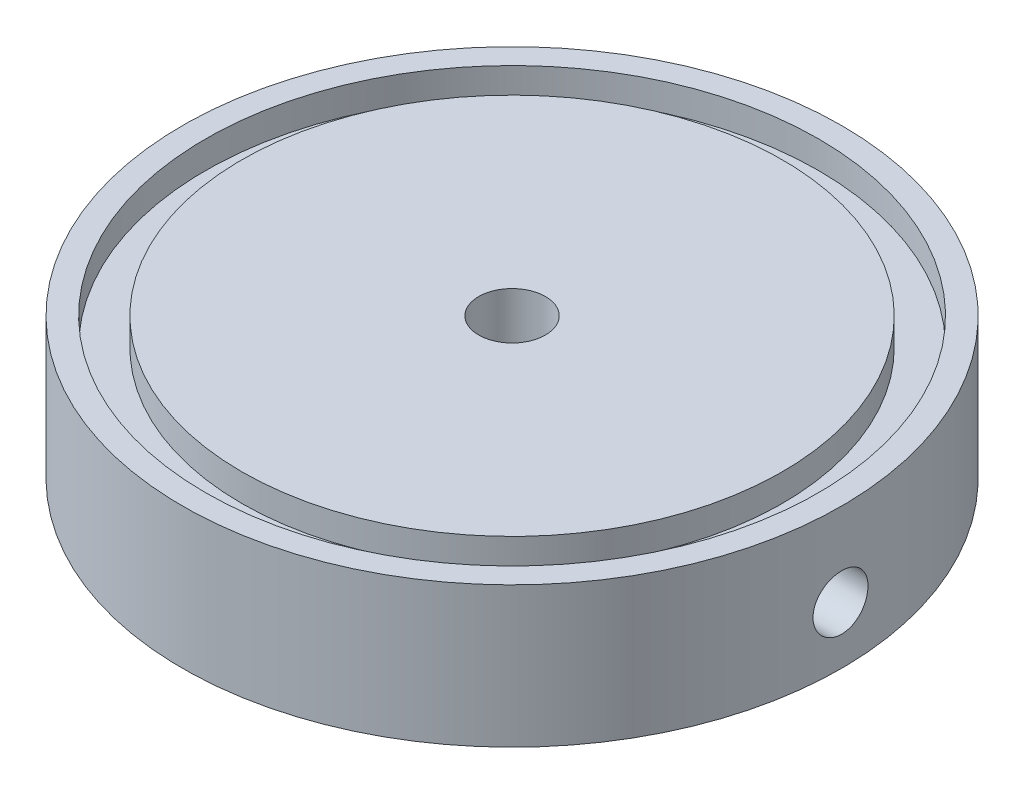
ISO-10303-21;
HEADER;
FILE_DESCRIPTION(('STEP AP214'),'2;1');
FILE_NAME('part.step','',(''),(''),'','','');
FILE_SCHEMA(('AUTOMOTIVE_DESIGN { 1 0 10303 214 1 1 1 1 }'));
ENDSEC;
DATA;
#1=APPLICATION_CONTEXT('core data for automotive mechanical design processes');
#2=APPLICATION_PROTOCOL_DEFINITION('international standard','automotive_design',2000,#1);
#3=PRODUCT_CONTEXT('',#1,'mechanical');
#4=PRODUCT('Part','Part','',(#3));
#5=PRODUCT_RELATED_PRODUCT_CATEGORY('part','',(#4));
#6=PRODUCT_DEFINITION_FORMATION('','',#4);
#7=PRODUCT_DEFINITION_CONTEXT('part definition',#1,'design');
#8=PRODUCT_DEFINITION('design','',#6,#7);
#9=PRODUCT_DEFINITION_SHAPE('','',#8);
#10=(LENGTH_UNIT() NAMED_UNIT(*) SI_UNIT(.MILLI.,.METRE.));
#11=(NAMED_UNIT(*) PLANE_ANGLE_UNIT() SI_UNIT($,.RADIAN.));
#12=(NAMED_UNIT(*) SI_UNIT($,.STERADIAN.) SOLID_ANGLE_UNIT());
#13=UNCERTAINTY_MEASURE_WITH_UNIT(LENGTH_MEASURE(1.E-05),#10,'distance_accuracy_value','');
#14=(GEOMETRIC_REPRESENTATION_CONTEXT(3) GLOBAL_UNCERTAINTY_ASSIGNED_CONTEXT((#13)) GLOBAL_UNIT_ASSIGNED_CONTEXT((#10,
#11,#12)) REPRESENTATION_CONTEXT('',''));
#15=CARTESIAN_POINT('',(0.,0.,0.));
#16=DIRECTION('',(0.,0.,1.));
#17=DIRECTION('',(1.,0.,0.));
#18=AXIS2_PLACEMENT_3D('',#15,#16,#17);
#19=CARTESIAN_POINT('',(38.1,-2.28600000000442,0.));
#20=DIRECTION('',(-1.,0.,0.));
#21=DIRECTION('',(0.,0.,1.));
#22=AXIS2_PLACEMENT_3D('',#19,#20,#21);
#23=CYLINDRICAL_SURFACE('',#22,1.7272);
#24=CARTESIAN_POINT('',(4.80191535530144,-0.723623755532479,-0.736342522682037));
#25=CARTESIAN_POINT('',(4.77186223711895,-0.695508027662611,-0.6766842015263));
#26=CARTESIAN_POINT('',(4.74519728640824,-0.670149780641417,-0.613995515617501));
#27=CARTESIAN_POINT('',(4.6997006609823,-0.62642981667209,-0.483501887721507));
#28=CARTESIAN_POINT('',(4.68086706884819,-0.608066387215166,-0.415698202892281));
#29=CARTESIAN_POINT('',(4.65179372325206,-0.579545173145753,-0.276251443595078));
#30=CARTESIAN_POINT('',(4.6415920832701,-0.569423787725918,-0.204592812198787));
#31=CARTESIAN_POINT('',(4.63040032480049,-0.558313427353962,-0.0598561049839643));
#32=CARTESIAN_POINT('',(4.62940859792253,-0.557322857825036,0.013221720757056));
#33=CARTESIAN_POINT('',(4.63649837031051,-0.564368860657253,0.154897778871572));
#34=CARTESIAN_POINT('',(4.64414058350532,-0.571968387338045,0.223540916446432));
#35=CARTESIAN_POINT('',(4.66746869161537,-0.594947638308812,0.358079653932202));
#36=CARTESIAN_POINT('',(4.68315467166714,-0.610327444946509,0.423975224754438));
#37=CARTESIAN_POINT('',(4.72228480294861,-0.648199006472655,0.55263829325285));
#38=CARTESIAN_POINT('',(4.74586430393426,-0.670814508980356,0.615327534340518));
#39=CARTESIAN_POINT('',(4.79977525029712,-0.721733582306487,0.735214922446919));
#40=CARTESIAN_POINT('',(4.83010951706252,-0.750039529476772,0.792410760603868));
#41=CARTESIAN_POINT('',(4.91171560659409,-0.824949363978454,0.925614555898395));
#42=CARTESIAN_POINT('',(4.96621899655739,-0.874001940002459,0.998266402915223));
#43=CARTESIAN_POINT('',(5.08438899156457,-0.977842273227169,1.13096632809429));
#44=CARTESIAN_POINT('',(5.14807711516609,-1.03264341394369,1.1909839703637));
#45=CARTESIAN_POINT('',(5.26566122440978,-1.13167887656766,1.28617866334988));
#46=CARTESIAN_POINT('',(5.31816196189335,-1.17523433676545,1.32384510843578));
#47=CARTESIAN_POINT('',(5.4261169706323,-1.26350787680583,1.39315518205311));
#48=CARTESIAN_POINT('',(5.48157278801267,-1.30822655886818,1.42479561732643));
#49=CARTESIAN_POINT('',(5.59481964246952,-1.39836374962955,1.4826304002712));
#50=CARTESIAN_POINT('',(5.65261363941882,-1.44378309726948,1.50881756961363));
#51=CARTESIAN_POINT('',(5.7699750773994,-1.53494562245343,1.55620542973719));
#52=CARTESIAN_POINT('',(5.82954311153864,-1.58068890431147,1.57740443127022));
#53=CARTESIAN_POINT('',(5.98717710024096,-1.70048335673669,1.62690244032982));
#54=CARTESIAN_POINT('',(6.08634802814557,-1.77460956138287,1.65152753096391));
#55=CARTESIAN_POINT('',(6.28700874920954,-1.92250418417874,1.69024645890892));
#56=CARTESIAN_POINT('',(6.38849995164998,-1.99627235001715,1.70433371068357));
#57=CARTESIAN_POINT('',(6.59314286291203,-2.1432841208424,1.72289140406074));
#58=CARTESIAN_POINT('',(6.69629836975414,-2.21652572612805,1.72733530032984));
#59=CARTESIAN_POINT('',(6.90324050283641,-2.36201675257392,1.72705850420594));
#60=CARTESIAN_POINT('',(7.00702696216003,-2.43426642096362,1.72234013875578));
#61=CARTESIAN_POINT('',(7.21970360852126,-2.58109341204515,1.70349173556486));
#62=CARTESIAN_POINT('',(7.32859504615123,-2.65561165539655,1.68891249003723));
#63=CARTESIAN_POINT('',(7.54570438106643,-2.80310160389555,1.64974277186861));
#64=CARTESIAN_POINT('',(7.65392197522599,-2.87607264418525,1.62514808362039));
#65=CARTESIAN_POINT('',(7.86826402064906,-3.01971063363882,1.5655379402369));
#66=CARTESIAN_POINT('',(7.97439588262935,-3.09038674526468,1.53057164560913));
#67=CARTESIAN_POINT('',(8.1838491117806,-3.22914165706115,1.44919744666333));
#68=CARTESIAN_POINT('',(8.28717330524154,-3.29722309918329,1.4028015602395));
#69=CARTESIAN_POINT('',(8.46831752518386,-3.41605973967605,1.30793643877834));
#70=CARTESIAN_POINT('',(8.54697361003414,-3.46747420794135,1.26190400768557));
#71=CARTESIAN_POINT('',(8.70024252765943,-3.56735971343047,1.16035288455229));
#72=CARTESIAN_POINT('',(8.77484930981358,-3.61582635826773,1.10482048488782));
#73=CARTESIAN_POINT('',(8.91850223913141,-3.70891134258468,0.982118815452525));
#74=CARTESIAN_POINT('',(8.98747637636184,-3.75348024749557,0.914825644334908));
#75=CARTESIAN_POINT('',(9.11496639800748,-3.83569241036066,0.767300634371547));
#76=CARTESIAN_POINT('',(9.17352088180981,-3.87336124539961,0.687118736553721));
#77=CARTESIAN_POINT('',(9.25236278858509,-3.92401063403261,0.550400415130571));
#78=CARTESIAN_POINT('',(9.27828734671245,-3.94064793280894,0.498488175165281));
#79=CARTESIAN_POINT('',(9.32311631436171,-3.96940010950055,0.390508248154328));
#80=CARTESIAN_POINT('',(9.34202704695845,-3.98151906082949,0.33444435886592));
#81=CARTESIAN_POINT('',(9.37137551939889,-4.00032096001182,0.218611289451272));
#82=CARTESIAN_POINT('',(9.38173056326914,-4.00695085399056,0.158811820807572));
#83=CARTESIAN_POINT('',(9.39249063016188,-4.01383999833945,0.0379647842521474));
#84=CARTESIAN_POINT('',(9.39290284191535,-4.01410385139779,-0.0230818499874414));
#85=CARTESIAN_POINT('',(9.38429478524852,-4.00859262914525,-0.136982649121262));
#86=CARTESIAN_POINT('',(9.37637140865176,-4.00351981434802,-0.189960360130125));
#87=CARTESIAN_POINT('',(9.35347280265172,-3.98885249385828,-0.293705473357298));
#88=CARTESIAN_POINT('',(9.33849356414226,-3.97925541750002,-0.344471601026274));
#89=CARTESIAN_POINT('',(9.29625961877905,-3.95217862235895,-0.460137442897521));
#90=CARTESIAN_POINT('',(9.26654309304615,-3.93311538524583,-0.523760727839246));
#91=CARTESIAN_POINT('',(9.19897910889834,-3.88971977923244,-0.644550095699817));
#92=CARTESIAN_POINT('',(9.16111369061252,-3.86537577073827,-0.701701483171564));
#93=CARTESIAN_POINT('',(9.056575694752,-3.79806787696212,-0.840053913398823));
#94=CARTESIAN_POINT('',(8.98568517045063,-3.75233622919917,-0.916684590224648));
#95=CARTESIAN_POINT('',(8.83530065490556,-3.65504160268728,-1.05651382176823));
#96=CARTESIAN_POINT('',(8.7557870238674,-3.60346529975991,-1.1196806993316));
#97=CARTESIAN_POINT('',(8.60151094562091,-3.50305694072647,-1.22748235761545));
#98=CARTESIAN_POINT('',(8.52736850811267,-3.4546686094187,-1.27344122556468));
#99=CARTESIAN_POINT('',(8.37619507889038,-3.35567742096141,-1.35765862365433));
#100=CARTESIAN_POINT('',(8.29916201576918,-3.30507297124137,-1.39591150170605));
#101=CARTESIAN_POINT('',(8.14297177933781,-3.20208173772617,-1.4655663717323));
#102=CARTESIAN_POINT('',(8.06381041600898,-3.14969137392434,-1.49695353855895));
#103=CARTESIAN_POINT('',(7.90412663631236,-3.04355936796271,-1.55336208308023));
#104=CARTESIAN_POINT('',(7.82360384997246,-2.98981735648797,-1.57838169972213));
#105=CARTESIAN_POINT('',(7.62465333608724,-2.85639639314508,-1.63253438430539));
#106=CARTESIAN_POINT('',(7.50572549425357,-2.77609169362757,-1.65831917188021));
#107=CARTESIAN_POINT('',(7.26709329620118,-2.61360201646067,-1.69790733337548));
#108=CARTESIAN_POINT('',(7.14738852653151,-2.53141596663883,-1.71170369141571));
#109=CARTESIAN_POINT('',(6.90836711801478,-2.36564748860692,-1.72736785745495));
#110=CARTESIAN_POINT('',(6.78905019109237,-2.2820667754075,-1.72924936867604));
#111=CARTESIAN_POINT('',(6.55172382287718,-2.11377996459469,-1.72065633825049));
#112=CARTESIAN_POINT('',(6.43371355926717,-2.02907465836078,-1.71019007284234));
#113=CARTESIAN_POINT('',(6.2475859081475,-1.89347450552002,-1.68279410405116));
#114=CARTESIAN_POINT('',(6.1786496781237,-1.8428039230012,-1.6702089907304));
#115=CARTESIAN_POINT('',(6.04199942265427,-1.74135230545683,-1.63993361076735));
#116=CARTESIAN_POINT('',(5.97428509737129,-1.69057130105075,-1.6222446151527));
#117=CARTESIAN_POINT('',(5.84055042879419,-1.58914184176068,-1.5813274600062));
#118=CARTESIAN_POINT('',(5.77452834148793,-1.53849330305116,-1.55810527996187));
#119=CARTESIAN_POINT('',(5.64467054836192,-1.4376020267214,-1.50554738398981));
#120=CARTESIAN_POINT('',(5.5808341103141,-1.38735915759244,-1.47621373930456));
#121=CARTESIAN_POINT('',(5.43085925880112,-1.26762727009308,-1.39755120790061));
#122=CARTESIAN_POINT('',(5.34608579946259,-1.19853104195896,-1.3449264199448));
#123=CARTESIAN_POINT('',(5.18498795367794,-1.0641869575254,-1.22413880469283));
#124=CARTESIAN_POINT('',(5.10864510383821,-0.998930843872178,-1.1560109739992));
#125=CARTESIAN_POINT('',(4.99298133712381,-0.897633697218219,-1.02942511697104));
#126=CARTESIAN_POINT('',(4.9500866502995,-0.859393215128875,-0.976001804096662));
#127=CARTESIAN_POINT('',(4.87078507788015,-0.787572846905296,-0.861674944670481));
#128=CARTESIAN_POINT('',(4.83437407294335,-0.753990004607977,-0.800776189419249));
#129=CARTESIAN_POINT('',(4.80191535530144,-0.723623755532479,-0.736342522682037));
#130=B_SPLINE_CURVE_WITH_KNOTS('',3,(#24,#25,#26,#27,#28,#29,#30,#31,#32,#33,#34,#35,#36,#37,
#38,#39,#40,#41,#42,#43,#44,#45,#46,#47,#48,#49,#50,#51,#52,#53,#54,#55,#56,#57,#58,#59,#60,#61,
#62,#63,#64,#65,#66,#67,#68,#69,#70,#71,#72,#73,#74,#75,#76,#77,#78,#79,#80,#81,#82,#83,#84,#85,
#86,#87,#88,#89,#90,#91,#92,#93,#94,#95,#96,#97,#98,#99,#100,#101,#102,#103,#104,#105,#106,#107,
#108,#109,#110,#111,#112,#113,#114,#115,#116,#117,#118,#119,#120,#121,#122,#123,#124,#125,#126,
#127,#128,#129),.UNSPECIFIED.,.T.,.F.,(4,2,2,2,2,2,2,2,2,2,2,2,2,2,2,2,2,2,2,2,2,2,2,2,2,2,2,2,
2,2,2,2,2,2,2,2,2,2,2,2,2,2,2,2,2,2,2,2,2,2,2,2,4),(0.,0.217222001562203,0.434390787433596,
0.652513528534496,0.870598176647974,1.07806764092871,1.28553930114523,1.49676809537143,
1.70808528348996,2.01602463811645,2.32469753982027,2.5581588515775,2.79174353527152,
3.02563377789516,3.25960311405534,3.63773978008851,4.01611256256732,4.39552558022503,
4.77484225082696,5.17271850944061,5.57076241182431,5.96694897615836,6.36272072633007,
6.67620388410822,6.99014324589484,7.307614875147,7.62388477717531,7.80439552449282,
7.98474314066401,8.16681418275955,8.34875358238263,8.50942683824988,8.67019149820098,
8.88725632730944,9.10480455066825,9.44480598986697,9.78559875189322,10.0844408013257,
10.3835012497851,10.6832012215607,10.9829839905336,11.4198123238719,11.8568961264702,
12.2934771491398,12.7297657145567,12.9890606267441,13.2482910219711,13.5072425379436,
13.7661064347507,14.1291594658649,14.4914009304748,14.7261601381405,14.9607696575755),.UNSPECIFIED.);
#131=CARTESIAN_POINT('',(4.80191535530144,-0.723623755532479,-0.736342522682037));
#132=VERTEX_POINT('',#131);
#133=EDGE_CURVE('E141',#132,#132,#130,.T.);
#134=ORIENTED_EDGE('',*,*,#133,.F.);
#135=EDGE_LOOP('',(#134));
#136=FACE_BOUND('',#135,.T.);
#137=CARTESIAN_POINT('',(28.575,-2.28600000000442,0.));
#138=DIRECTION('',(1.,0.,0.));
#139=DIRECTION('',(0.,0.,-1.));
#140=AXIS2_PLACEMENT_3D('',#137,#138,#139);
#141=CIRCLE('',#140,1.7272);
#142=CARTESIAN_POINT('',(28.575,-2.28600000000442,-1.7272));
#143=VERTEX_POINT('',#142);
#144=EDGE_CURVE('E67',#143,#143,#141,.T.);
#145=ORIENTED_EDGE('',*,*,#144,.T.);
#146=EDGE_LOOP('',(#145));
#147=FACE_BOUND('',#146,.T.);
#148=ADVANCED_FACE('F43',(#136,#147),#23,.F.);
#149=CARTESIAN_POINT('',(3.86080000000004,7.36599999999557,0.));
#150=DIRECTION('',(0.,1.,0.));
#151=DIRECTION('',(0.,0.,1.));
#152=AXIS2_PLACEMENT_3D('',#149,#150,#151);
#153=PLANE('',#152);
#154=CARTESIAN_POINT('',(0.,7.36599999999557,0.));
#155=DIRECTION('',(0.,-1.,0.));
#156=DIRECTION('',(0.,0.,-1.));
#157=AXIS2_PLACEMENT_3D('',#154,#155,#156);
#158=CIRCLE('',#157,3.86079999999999);
#159=CARTESIAN_POINT('',(0.,7.36599999999557,-3.86079999999999));
#160=VERTEX_POINT('',#159);
#161=EDGE_CURVE('E511',#160,#160,#158,.T.);
#162=ORIENTED_EDGE('',*,*,#161,.T.);
#163=EDGE_LOOP('',(#162));
#164=FACE_BOUND('',#163,.T.);
#165=CARTESIAN_POINT('',(0.,7.36599999999557,0.));
#166=DIRECTION('',(0.,1.,0.));
#167=DIRECTION('',(0.,0.,1.));
#168=AXIS2_PLACEMENT_3D('',#165,#166,#167);
#169=CIRCLE('',#168,31.242);
#170=CARTESIAN_POINT('',(0.,7.36599999999557,31.242));
#171=VERTEX_POINT('',#170);
#172=EDGE_CURVE('E129',#171,#171,#169,.T.);
#173=ORIENTED_EDGE('',*,*,#172,.T.);
#174=EDGE_LOOP('',(#173));
#175=FACE_BOUND('',#174,.T.);
#176=ADVANCED_FACE('F155',(#164,#175),#153,.T.);
#177=CARTESIAN_POINT('',(0.,-4.42701431069281E-12,0.));
#178=DIRECTION('',(0.,-1.,0.));
#179=DIRECTION('',(0.,0.,-1.));
#180=AXIS2_PLACEMENT_3D('',#177,#178,#179);
#181=CONICAL_SURFACE('',#180,3.86079999999999,0.943079516414084);
#182=CARTESIAN_POINT('',(0.,-4.42701431069281E-12,0.));
#183=DIRECTION('',(0.,-1.,0.));
#184=DIRECTION('',(0.,0.,-1.));
#185=AXIS2_PLACEMENT_3D('',#182,#183,#184);
#186=CIRCLE('',#185,3.86079999999999);
#187=CARTESIAN_POINT('',(0.,-4.42701431069281E-12,-3.86079999999999));
#188=VERTEX_POINT('',#187);
#189=EDGE_CURVE('E149',#188,#188,#186,.T.);
#190=ORIENTED_EDGE('',*,*,#189,.F.);
#191=EDGE_LOOP('',(#190));
#192=FACE_BOUND('',#191,.T.);
#193=CARTESIAN_POINT('',(0.,-4.06400000000444,0.));
#194=DIRECTION('',(0.,-1.,0.));
#195=DIRECTION('',(0.,0.,-1.));
#196=AXIS2_PLACEMENT_3D('',#193,#194,#195);
#197=CIRCLE('',#196,9.46149999999993);
#198=CARTESIAN_POINT('',(0.,-4.06400000000444,-9.46149999999993));
#199=VERTEX_POINT('',#198);
#200=EDGE_CURVE('E55',#199,#199,#197,.T.);
#201=ORIENTED_EDGE('',*,*,#200,.T.);
#202=EDGE_LOOP('',(#201));
#203=FACE_BOUND('',#202,.T.);
#204=ORIENTED_EDGE('',*,*,#133,.T.);
#205=EDGE_LOOP('',(#204));
#206=FACE_BOUND('',#205,.T.);
#207=ADVANCED_FACE('F45',(#192,#203,#206),#181,.F.);
#208=CARTESIAN_POINT('',(0.,101.604645460313,0.));
#209=DIRECTION('',(0.,-1.,0.));
#210=DIRECTION('',(0.,0.,-1.));
#211=AXIS2_PLACEMENT_3D('',#208,#209,#210);
#212=CYLINDRICAL_SURFACE('',#211,38.1);
#213=CARTESIAN_POINT('',(37.967477859347,-2.28600000000442,-3.175));
#214=CARTESIAN_POINT('',(37.9674796148514,-2.10799137459055,-3.174992223886));
#215=CARTESIAN_POINT('',(37.9687432124493,-1.92986156393965,-3.15997936696993));
#216=CARTESIAN_POINT('',(37.9736610260084,-1.57853056040072,-3.10031123355846));
#217=CARTESIAN_POINT('',(37.9773179506743,-1.4053351842216,-3.05562236969804));
#218=CARTESIAN_POINT('',(37.9866053672743,-1.06901235231119,-2.93790365154258));
#219=CARTESIAN_POINT('',(37.9922347401669,-0.905879249473695,-2.86488986449255));
#220=CARTESIAN_POINT('',(38.0048313657025,-0.594222855211688,-2.69262246744107));
#221=CARTESIAN_POINT('',(38.0117983322355,-0.445696449684329,-2.59337446720523));
#222=CARTESIAN_POINT('',(38.0263052267685,-0.167049440268157,-2.37118060325433));
#223=CARTESIAN_POINT('',(38.033846422922,-0.0369715038395908,-2.24818130945098));
#224=CARTESIAN_POINT('',(38.0486404573867,0.2007195828014,-1.98208938314658));
#225=CARTESIAN_POINT('',(38.0558932830885,0.308331751528685,-1.83899587322542));
#226=CARTESIAN_POINT('',(38.0693053861151,0.498178501528936,-1.53652297885541));
#227=CARTESIAN_POINT('',(38.0754630672337,0.580376167096676,-1.3771203474996));
#228=CARTESIAN_POINT('',(38.0859774147698,0.716824484296814,-1.04671622158357));
#229=CARTESIAN_POINT('',(38.0903341127107,0.771075625094883,-0.875714930101311));
#230=CARTESIAN_POINT('',(38.0967467506224,0.849968086238491,-0.527392252134298));
#231=CARTESIAN_POINT('',(38.0988080535635,0.874678435799821,-0.350086600537618));
#232=CARTESIAN_POINT('',(38.1004158213117,0.894001270106652,0.00616674500017873));
#233=CARTESIAN_POINT('',(38.0999623328846,0.888614314552522,0.185114408344069));
#234=CARTESIAN_POINT('',(38.0965960392816,0.847951910326072,0.539104051072239));
#235=CARTESIAN_POINT('',(38.0936893421403,0.812750692867242,0.714154623480081));
#236=CARTESIAN_POINT('',(38.0857505953842,0.713574420690951,1.05585407967778));
#237=CARTESIAN_POINT('',(38.0807185255475,0.649599092201483,1.22250288351202));
#238=CARTESIAN_POINT('',(38.0690846412153,0.494607890894126,1.54290446002202));
#239=CARTESIAN_POINT('',(38.0624808988053,0.40355877314451,1.69664107794224));
#240=CARTESIAN_POINT('',(38.0484457872988,0.197028683983461,1.98667794141065));
#241=CARTESIAN_POINT('',(38.0410144014161,0.0815472169947486,2.12297783318834));
#242=CARTESIAN_POINT('',(38.0261325057258,-0.170987846862343,2.37470621318252));
#243=CARTESIAN_POINT('',(38.0186820064471,-0.308105945954129,2.49007000291146));
#244=CARTESIAN_POINT('',(38.004624326273,-0.599797203748761,2.69615157657959));
#245=CARTESIAN_POINT('',(37.9980171460728,-0.754370376840316,2.78686934020215));
#246=CARTESIAN_POINT('',(37.9863929785793,-1.07662944367989,2.94108125458357));
#247=CARTESIAN_POINT('',(37.9813761874432,-1.24431695176081,3.00457204753268));
#248=CARTESIAN_POINT('',(37.9735046116395,-1.58802297981634,3.10247984731552));
#249=CARTESIAN_POINT('',(37.9706497815192,-1.76404132456204,3.136897465381));
#250=CARTESIAN_POINT('',(37.967432729465,-2.11884636731748,3.17560002074756));
#251=CARTESIAN_POINT('',(37.9670630442667,-2.29762315889829,3.17997518092429));
#252=CARTESIAN_POINT('',(37.9688384390387,-2.653367641092,3.15870496351731));
#253=CARTESIAN_POINT('',(37.9709834955532,-2.8303353485634,3.13305986594426));
#254=CARTESIAN_POINT('',(37.9775398735957,-3.17717917966798,3.05255231894487));
#255=CARTESIAN_POINT('',(37.981947928906,-3.34706514343725,2.99773197439151));
#256=CARTESIAN_POINT('',(37.9925309166028,-3.6752278608743,2.86047288657974));
#257=CARTESIAN_POINT('',(37.9987058773397,-3.83350442821541,2.77803370016694));
#258=CARTESIAN_POINT('',(38.0121450024562,-4.13436832580058,2.58764877433316));
#259=CARTESIAN_POINT('',(38.0194117192608,-4.27691749516941,2.47964291244999));
#260=CARTESIAN_POINT('',(38.0342069443176,-4.54189446238362,2.24127735771924));
#261=CARTESIAN_POINT('',(38.0417354570727,-4.66432191391979,2.11091728021842));
#262=CARTESIAN_POINT('',(38.0562282152053,-4.8858881383243,1.83115385899478));
#263=CARTESIAN_POINT('',(38.0631910120889,-4.98496829078934,1.68170400390121));
#264=CARTESIAN_POINT('',(38.0757469329061,-5.15662517557185,1.36823511345573));
#265=CARTESIAN_POINT('',(38.0813400705265,-5.22920217273458,1.20421622371214));
#266=CARTESIAN_POINT('',(38.0905198062144,-5.34569188167546,0.866475212585344));
#267=CARTESIAN_POINT('',(38.0941089410165,-5.38964084359246,0.692765665902923));
#268=CARTESIAN_POINT('',(38.0988865697222,-5.44774540927367,0.340401843535497));
#269=CARTESIAN_POINT('',(38.1000751090659,-5.46190157697817,0.161747661511104));
#270=CARTESIAN_POINT('',(38.0999176999799,-5.46001213177132,-0.19485625365699));
#271=CARTESIAN_POINT('',(38.0985794181538,-5.44405787666705,-0.372806481371152));
#272=CARTESIAN_POINT('',(38.0935339028085,-5.38259097943029,-0.723490780794735));
#273=CARTESIAN_POINT('',(38.0898266660717,-5.33707829715076,-0.896224845419092));
#274=CARTESIAN_POINT('',(38.0804591991,-5.21780969986591,-1.23157947247479));
#275=CARTESIAN_POINT('',(38.0747990823493,-5.14405542598607,-1.39420062193183));
#276=CARTESIAN_POINT('',(38.0621590787552,-4.97040774586677,-1.7047672689544));
#277=CARTESIAN_POINT('',(38.055179212783,-4.87051475298898,-1.85271299854823));
#278=CARTESIAN_POINT('',(38.0406579324267,-4.64708235285857,-2.13019668392583));
#279=CARTESIAN_POINT('',(38.0331149513177,-4.52347534677913,-2.25968012625115));
#280=CARTESIAN_POINT('',(38.0183309031222,-4.25624571429949,-2.49611459932655));
#281=CARTESIAN_POINT('',(38.0110899095966,-4.11261824769125,-2.60306016549813));
#282=CARTESIAN_POINT('',(37.9977149749742,-3.80914592277891,-2.79152787825786));
#283=CARTESIAN_POINT('',(37.9915831336506,-3.64927118125046,-2.87300201198062));
#284=CARTESIAN_POINT('',(37.9811464024721,-3.31816888837208,-3.00784546046481));
#285=CARTESIAN_POINT('',(37.9768394132918,-3.14695464582989,-3.0612470872011));
#286=CARTESIAN_POINT('',(37.971647709959,-2.85994194258297,-3.1248289611693));
#287=CARTESIAN_POINT('',(37.9700912043148,-2.74598938743211,-3.14361809063546));
#288=CARTESIAN_POINT('',(37.9680057114582,-2.51670818992462,-3.16870611338372));
#289=CARTESIAN_POINT('',(37.9674767214846,-2.40137955126678,-3.17500504023073));
#290=CARTESIAN_POINT('',(37.967477859347,-2.28600000000442,-3.175));
#291=B_SPLINE_CURVE_WITH_KNOTS('',3,(#213,#214,#215,#216,#217,#218,#219,#220,#221,#222,#223,
#224,#225,#226,#227,#228,#229,#230,#231,#232,#233,#234,#235,#236,#237,#238,#239,#240,#241,#242,
#243,#244,#245,#246,#247,#248,#249,#250,#251,#252,#253,#254,#255,#256,#257,#258,#259,#260,#261,
#262,#263,#264,#265,#266,#267,#268,#269,#270,#271,#272,#273,#274,#275,#276,#277,#278,#279,#280,
#281,#282,#283,#284,#285,#286,#287,#288,#289,#290),.UNSPECIFIED.,.T.,.F.,(4,2,2,2,2,2,2,2,2,2,2,
2,2,2,2,2,2,2,2,2,2,2,2,2,2,2,2,2,2,2,2,2,2,2,2,2,2,2,4),(0.,0.533604603517507,1.06781417349037,
1.60172115641093,2.13551406411709,2.67052206526965,3.2055534349789,3.74135834978334,
4.27715388573729,4.81169494296257,5.34622605970217,5.87943020597204,6.41263942553357,
6.94650611589526,7.4803836360617,8.01588389273743,8.55138459084429,9.08695131145285,
9.62250677207596,10.1564531576629,10.6903945629631,11.2235674807547,11.7567489539102,
12.2911969327788,12.8256541089181,13.3614392326626,13.8972190021753,14.4323190169852,
14.9674089029308,15.5008778862256,16.0343475940937,16.5677863066157,17.1012165837663,
17.6361906712906,18.1712943208452,18.7074006261176,19.2428885044878,19.5887550320897,
19.9346206302438),.UNSPECIFIED.);
#292=CARTESIAN_POINT('',(37.967477859347,-2.28600000000442,-3.175));
#293=VERTEX_POINT('',#292);
#294=EDGE_CURVE('E12',#293,#293,#291,.T.);
#295=ORIENTED_EDGE('',*,*,#294,.F.);
#296=EDGE_LOOP('',(#295));
#297=FACE_BOUND('',#296,.T.);
#298=CARTESIAN_POINT('',(0.,7.36599999999557,0.));
#299=DIRECTION('',(0.,-1.,0.));
#300=DIRECTION('',(0.,0.,-1.));
#301=AXIS2_PLACEMENT_3D('',#298,#299,#300);
#302=CIRCLE('',#301,38.1);
#303=CARTESIAN_POINT('',(0.,7.36599999999557,-38.1));
#304=VERTEX_POINT('',#303);
#305=EDGE_CURVE('E513',#304,#304,#302,.T.);
#306=ORIENTED_EDGE('',*,*,#305,.T.);
#307=EDGE_LOOP('',(#306));
#308=FACE_BOUND('',#307,.T.);
#309=CARTESIAN_POINT('',(0.,-8.89000000000442,0.));
#310=DIRECTION('',(0.,-1.,0.));
#311=DIRECTION('',(0.,0.,-1.));
#312=AXIS2_PLACEMENT_3D('',#309,#310,#311);
#313=CIRCLE('',#312,38.1);
#314=CARTESIAN_POINT('',(0.,-8.89000000000442,-38.1));
#315=VERTEX_POINT('',#314);
#316=EDGE_CURVE('E516',#315,#315,#313,.T.);
#317=ORIENTED_EDGE('',*,*,#316,.F.);
#318=EDGE_LOOP('',(#317));
#319=FACE_BOUND('',#318,.T.);
#320=ADVANCED_FACE('F167',(#297,#308,#319),#212,.T.);
#321=CARTESIAN_POINT('',(0.,-6.391948453042,0.));
#322=DIRECTION('',(0.,-1.,0.));
#323=DIRECTION('',(0.,0.,-1.));
#324=AXIS2_PLACEMENT_3D('',#321,#322,#323);
#325=TOROIDAL_SURFACE('',#324,8.44549999999992,2.54);
#326=CARTESIAN_POINT('',(0.,-6.391948453042,0.));
#327=DIRECTION('',(0.,-1.,0.));
#328=DIRECTION('',(0.,0.,-1.));
#329=AXIS2_PLACEMENT_3D('',#326,#327,#328);
#330=CIRCLE('',#329,10.9854999999999);
#331=CARTESIAN_POINT('',(0.,-6.391948453042,-10.9854999999999));
#332=VERTEX_POINT('',#331);
#333=EDGE_CURVE('E59',#332,#332,#330,.T.);
#334=ORIENTED_EDGE('',*,*,#333,.T.);
#335=EDGE_LOOP('',(#334));
#336=FACE_BOUND('',#335,.T.);
#337=ORIENTED_EDGE('',*,*,#200,.F.);
#338=EDGE_LOOP('',(#337));
#339=FACE_BOUND('',#338,.T.);
#340=ADVANCED_FACE('F171',(#336,#339),#325,.F.);
#341=CARTESIAN_POINT('',(0.,101.604645460313,0.));
#342=DIRECTION('',(0.,-1.,0.));
#343=DIRECTION('',(0.,0.,-1.));
#344=AXIS2_PLACEMENT_3D('',#341,#342,#343);
#345=CYLINDRICAL_SURFACE('',#344,10.9854999999999);
#346=CARTESIAN_POINT('',(0.,-8.89000000000444,0.));
#347=DIRECTION('',(0.,-1.,0.));
#348=DIRECTION('',(0.,0.,-1.));
#349=AXIS2_PLACEMENT_3D('',#346,#347,#348);
#350=CIRCLE('',#349,10.9854999999999);
#351=CARTESIAN_POINT('',(0.,-8.89000000000444,-10.9854999999999));
#352=VERTEX_POINT('',#351);
#353=EDGE_CURVE('E64',#352,#352,#350,.T.);
#354=ORIENTED_EDGE('',*,*,#353,.T.);
#355=EDGE_LOOP('',(#354));
#356=FACE_BOUND('',#355,.T.);
#357=ORIENTED_EDGE('',*,*,#333,.F.);
#358=EDGE_LOOP('',(#357));
#359=FACE_BOUND('',#358,.T.);
#360=ADVANCED_FACE('F191',(#356,#359),#345,.F.);
#361=CARTESIAN_POINT('',(10.9855,-8.89000000000443,0.));
#362=DIRECTION('',(0.,-1.,0.));
#363=DIRECTION('',(0.,0.,-1.));
#364=AXIS2_PLACEMENT_3D('',#361,#362,#363);
#365=PLANE('',#364);
#366=CARTESIAN_POINT('',(0.,-8.89000000000442,0.));
#367=DIRECTION('',(0.,-1.,0.));
#368=DIRECTION('',(0.,0.,-1.));
#369=AXIS2_PLACEMENT_3D('',#366,#367,#368);
#370=CIRCLE('',#369,21.1454999999999);
#371=CARTESIAN_POINT('',(0.,-8.89000000000442,-21.1454999999999));
#372=VERTEX_POINT('',#371);
#373=EDGE_CURVE('E530',#372,#372,#370,.T.);
#374=ORIENTED_EDGE('',*,*,#373,.T.);
#375=EDGE_LOOP('',(#374));
#376=FACE_BOUND('',#375,.T.);
#377=ORIENTED_EDGE('',*,*,#353,.F.);
#378=EDGE_LOOP('',(#377));
#379=FACE_BOUND('',#378,.T.);
#380=ADVANCED_FACE('F187',(#376,#379),#365,.T.);
#381=CARTESIAN_POINT('',(0.,101.604645460313,0.));
#382=DIRECTION('',(0.,-1.,0.));
#383=DIRECTION('',(0.,0.,-1.));
#384=AXIS2_PLACEMENT_3D('',#381,#382,#383);
#385=CYLINDRICAL_SURFACE('',#384,21.1454999999999);
#386=CARTESIAN_POINT('',(0.,-7.87400000000443,0.));
#387=DIRECTION('',(0.,-1.,0.));
#388=DIRECTION('',(0.,0.,-1.));
#389=AXIS2_PLACEMENT_3D('',#386,#387,#388);
#390=CIRCLE('',#389,21.1454999999999);
#391=CARTESIAN_POINT('',(0.,-7.87400000000443,-21.1454999999999));
#392=VERTEX_POINT('',#391);
#393=EDGE_CURVE('E527',#392,#392,#390,.T.);
#394=ORIENTED_EDGE('',*,*,#393,.T.);
#395=EDGE_LOOP('',(#394));
#396=FACE_BOUND('',#395,.T.);
#397=ORIENTED_EDGE('',*,*,#373,.F.);
#398=EDGE_LOOP('',(#397));
#399=FACE_BOUND('',#398,.T.);
#400=ADVANCED_FACE('F183',(#396,#399),#385,.T.);
#401=CARTESIAN_POINT('',(21.1455,-7.87400000000443,0.));
#402=DIRECTION('',(0.,-1.,0.));
#403=DIRECTION('',(0.,0.,-1.));
#404=AXIS2_PLACEMENT_3D('',#401,#402,#403);
#405=PLANE('',#404);
#406=CARTESIAN_POINT('',(0.,-7.87400000000443,0.));
#407=DIRECTION('',(0.,-1.,0.));
#408=DIRECTION('',(0.,0.,-1.));
#409=AXIS2_PLACEMENT_3D('',#406,#407,#408);
#410=CIRCLE('',#409,22.6694999999999);
#411=CARTESIAN_POINT('',(0.,-7.87400000000443,-22.6694999999999));
#412=VERTEX_POINT('',#411);
#413=EDGE_CURVE('E524',#412,#412,#410,.T.);
#414=ORIENTED_EDGE('',*,*,#413,.T.);
#415=EDGE_LOOP('',(#414));
#416=FACE_BOUND('',#415,.T.);
#417=ORIENTED_EDGE('',*,*,#393,.F.);
#418=EDGE_LOOP('',(#417));
#419=FACE_BOUND('',#418,.T.);
#420=ADVANCED_FACE('F179',(#416,#419),#405,.T.);
#421=CARTESIAN_POINT('',(0.,101.604645460313,0.));
#422=DIRECTION('',(0.,-1.,0.));
#423=DIRECTION('',(0.,0.,-1.));
#424=AXIS2_PLACEMENT_3D('',#421,#422,#423);
#425=CYLINDRICAL_SURFACE('',#424,22.6694999999999);
#426=CARTESIAN_POINT('',(0.,-8.89000000000442,0.));
#427=DIRECTION('',(0.,-1.,0.));
#428=DIRECTION('',(0.,0.,-1.));
#429=AXIS2_PLACEMENT_3D('',#426,#427,#428);
#430=CIRCLE('',#429,22.6694999999999);
#431=CARTESIAN_POINT('',(0.,-8.89000000000442,-22.6694999999999));
#432=VERTEX_POINT('',#431);
#433=EDGE_CURVE('E521',#432,#432,#430,.T.);
#434=ORIENTED_EDGE('',*,*,#433,.T.);
#435=EDGE_LOOP('',(#434));
#436=FACE_BOUND('',#435,.T.);
#437=ORIENTED_EDGE('',*,*,#413,.F.);
#438=EDGE_LOOP('',(#437));
#439=FACE_BOUND('',#438,.T.);
#440=ADVANCED_FACE('F175',(#436,#439),#425,.F.);
#441=CARTESIAN_POINT('',(22.6695,-8.89000000000442,0.));
#442=DIRECTION('',(0.,-1.,0.));
#443=DIRECTION('',(0.,0.,-1.));
#444=AXIS2_PLACEMENT_3D('',#441,#442,#443);
#445=PLANE('',#444);
#446=CARTESIAN_POINT('',(-4.85173008401352,-8.89000000000442,-27.5155286191612));
#447=DIRECTION('',(0.,-1.,0.));
#448=DIRECTION('',(-0.64278760968653,0.,-0.766044443118986));
#449=AXIS2_PLACEMENT_3D('',#446,#447,#448);
#450=CIRCLE('',#449,1.03251);
#451=CARTESIAN_POINT('',(-5.51541471889096,-8.89000000000442,-28.306477167126));
#452=VERTEX_POINT('',#451);
#453=EDGE_CURVE('E69',#452,#452,#450,.T.);
#454=ORIENTED_EDGE('',*,*,#453,.F.);
#455=EDGE_LOOP('',(#454));
#456=FACE_BOUND('',#455,.T.);
#457=CARTESIAN_POINT('',(-21.403281740744,-8.89000000000442,-17.9594858146423));
#458=DIRECTION('',(0.,-1.,0.));
#459=DIRECTION('',(-0.984807753012206,0.,-0.17364817766694));
#460=AXIS2_PLACEMENT_3D('',#457,#458,#459);
#461=CIRCLE('',#460,1.03251);
#462=CARTESIAN_POINT('',(-22.4201055938066,-8.89000000000442,-18.1387792945652));
#463=VERTEX_POINT('',#462);
#464=EDGE_CURVE('E82',#463,#463,#461,.T.);
#465=ORIENTED_EDGE('',*,*,#464,.F.);
#466=EDGE_LOOP('',(#465));
#467=FACE_BOUND('',#466,.T.);
#468=CARTESIAN_POINT('',(-27.94,-8.89000000000442,-4.47558656802016E-13));
#469=DIRECTION('',(0.,-1.,0.));
#470=DIRECTION('',(-0.866025403784443,0.,0.499999999999992));
#471=AXIS2_PLACEMENT_3D('',#468,#469,#470);
#472=CIRCLE('',#471,1.03251);
#473=CARTESIAN_POINT('',(-28.8341798896615,-8.89000000000442,0.516254999999544));
#474=VERTEX_POINT('',#473);
#475=EDGE_CURVE('E87',#474,#474,#472,.T.);
#476=ORIENTED_EDGE('',*,*,#475,.F.);
#477=EDGE_LOOP('',(#476));
#478=FACE_BOUND('',#477,.T.);
#479=CARTESIAN_POINT('',(-21.4032817407445,-8.89000000000442,17.9594858146416));
#480=DIRECTION('',(0.,-1.,0.));
#481=DIRECTION('',(-0.342020143325676,0.,0.939692620785906));
#482=AXIS2_PLACEMENT_3D('',#479,#480,#481);
#483=CIRCLE('',#482,1.03251);
#484=CARTESIAN_POINT('',(-21.7564209589297,-8.89000000000442,18.9297278425293));
#485=VERTEX_POINT('',#484);
#486=EDGE_CURVE('E93',#485,#485,#483,.T.);
#487=ORIENTED_EDGE('',*,*,#486,.F.);
#488=EDGE_LOOP('',(#487));
#489=FACE_BOUND('',#488,.T.);
#490=CARTESIAN_POINT('',(-4.85173008401439,-8.89000000000442,27.5155286191611));
#491=DIRECTION('',(0.,-1.,0.));
#492=DIRECTION('',(0.342020143325663,0.,0.939692620785911));
#493=AXIS2_PLACEMENT_3D('',#490,#491,#492);
#494=CIRCLE('',#493,1.03251);
#495=CARTESIAN_POINT('',(-4.49859086582921,-8.89000000000442,28.4857706470487));
#496=VERTEX_POINT('',#495);
#497=EDGE_CURVE('E99',#496,#496,#494,.T.);
#498=ORIENTED_EDGE('',*,*,#497,.F.);
#499=EDGE_LOOP('',(#498));
#500=FACE_BOUND('',#499,.T.);
#501=CARTESIAN_POINT('',(13.9699999999997,-8.89000000000442,24.1967497817374));
#502=DIRECTION('',(0.,-1.,0.));
#503=DIRECTION('',(0.866025403784436,0.,0.500000000000004));
#504=AXIS2_PLACEMENT_3D('',#501,#502,#503);
#505=CIRCLE('',#504,1.03251);
#506=CARTESIAN_POINT('',(14.8641798896612,-8.89000000000442,24.7130047817374));
#507=VERTEX_POINT('',#506);
#508=EDGE_CURVE('E105',#507,#507,#505,.T.);
#509=ORIENTED_EDGE('',*,*,#508,.F.);
#510=EDGE_LOOP('',(#509));
#511=FACE_BOUND('',#510,.T.);
#512=CARTESIAN_POINT('',(26.2550118247582,-8.89000000000442,9.55604280451945));
#513=DIRECTION('',(0.,-1.,0.));
#514=DIRECTION('',(0.984807753012209,0.,-0.173648177666927));
#515=AXIS2_PLACEMENT_3D('',#512,#513,#514);
#516=CIRCLE('',#515,1.03251);
#517=CARTESIAN_POINT('',(27.2718356778208,-8.89000000000442,9.37674932459657));
#518=VERTEX_POINT('',#517);
#519=EDGE_CURVE('E111',#518,#518,#516,.T.);
#520=ORIENTED_EDGE('',*,*,#519,.F.);
#521=EDGE_LOOP('',(#520));
#522=FACE_BOUND('',#521,.T.);
#523=CARTESIAN_POINT('',(26.2550118247584,-8.89000000000442,-9.55604280451898));
#524=DIRECTION('',(0.,-1.,0.));
#525=DIRECTION('',(0.642787609686541,0.,-0.766044443118977));
#526=AXIS2_PLACEMENT_3D('',#523,#524,#525);
#527=CIRCLE('',#526,1.03251);
#528=CARTESIAN_POINT('',(26.9186964596358,-8.89000000000442,-10.3469913524838));
#529=VERTEX_POINT('',#528);
#530=EDGE_CURVE('E117',#529,#529,#527,.T.);
#531=ORIENTED_EDGE('',*,*,#530,.F.);
#532=EDGE_LOOP('',(#531));
#533=FACE_BOUND('',#532,.T.);
#534=CARTESIAN_POINT('',(13.9700000000002,-8.89000000000442,-24.1967497817372));
#535=DIRECTION('',(0.,-1.,0.));
#536=DIRECTION('',(0.,0.,-1.));
#537=AXIS2_PLACEMENT_3D('',#534,#535,#536);
#538=CIRCLE('',#537,1.03251);
#539=CARTESIAN_POINT('',(13.9700000000002,-8.89000000000442,-25.2292597817372));
#540=VERTEX_POINT('',#539);
#541=EDGE_CURVE('E123',#540,#540,#538,.T.);
#542=ORIENTED_EDGE('',*,*,#541,.F.);
#543=EDGE_LOOP('',(#542));
#544=FACE_BOUND('',#543,.T.);
#545=ORIENTED_EDGE('',*,*,#316,.T.);
#546=EDGE_LOOP('',(#545));
#547=FACE_BOUND('',#546,.T.);
#548=ORIENTED_EDGE('',*,*,#433,.F.);
#549=EDGE_LOOP('',(#548));
#550=FACE_BOUND('',#549,.T.);
#551=ADVANCED_FACE('F165',(#456,#467,#478,#489,#500,#511,#522,#533,#544,#547,#550),#445,.T.);
#552=CARTESIAN_POINT('',(0.,7.36599999999557,0.));
#553=DIRECTION('',(0.,1.,0.));
#554=DIRECTION('',(0.,0.,1.));
#555=AXIS2_PLACEMENT_3D('',#552,#553,#554);
#556=CIRCLE('',#555,35.433);
#557=CARTESIAN_POINT('',(0.,7.36599999999557,35.433));
#558=VERTEX_POINT('',#557);
#559=EDGE_CURVE('E135',#558,#558,#556,.T.);
#560=ORIENTED_EDGE('',*,*,#559,.F.);
#561=EDGE_LOOP('',(#560));
#562=FACE_BOUND('',#561,.T.);
#563=ORIENTED_EDGE('',*,*,#305,.F.);
#564=EDGE_LOOP('',(#563));
#565=FACE_BOUND('',#564,.T.);
#566=ADVANCED_FACE('F162',(#562,#565),#153,.T.);
#567=CARTESIAN_POINT('',(0.,101.604645460313,0.));
#568=DIRECTION('',(0.,-1.,0.));
#569=DIRECTION('',(0.,0.,-1.));
#570=AXIS2_PLACEMENT_3D('',#567,#568,#569);
#571=CYLINDRICAL_SURFACE('',#570,3.86079999999999);
#572=ORIENTED_EDGE('',*,*,#189,.T.);
#573=EDGE_LOOP('',(#572));
#574=FACE_BOUND('',#573,.T.);
#575=ORIENTED_EDGE('',*,*,#161,.F.);
#576=EDGE_LOOP('',(#575));
#577=FACE_BOUND('',#576,.T.);
#578=ADVANCED_FACE('F159',(#574,#577),#571,.F.);
#579=CARTESIAN_POINT('',(0.,4.19099999999557,0.));
#580=DIRECTION('',(0.,1.,0.));
#581=DIRECTION('',(0.,0.,1.));
#582=AXIS2_PLACEMENT_3D('',#579,#580,#581);
#583=CYLINDRICAL_SURFACE('',#582,35.433);
#584=CARTESIAN_POINT('',(0.,4.19099999999557,0.));
#585=DIRECTION('',(0.,1.,0.));
#586=DIRECTION('',(0.,0.,1.));
#587=AXIS2_PLACEMENT_3D('',#584,#585,#586);
#588=CIRCLE('',#587,35.433);
#589=CARTESIAN_POINT('',(0.,4.19099999999557,35.433));
#590=VERTEX_POINT('',#589);
#591=EDGE_CURVE('E138',#590,#590,#588,.T.);
#592=ORIENTED_EDGE('',*,*,#591,.F.);
#593=EDGE_LOOP('',(#592));
#594=FACE_BOUND('',#593,.T.);
#595=ORIENTED_EDGE('',*,*,#559,.T.);
#596=EDGE_LOOP('',(#595));
#597=FACE_BOUND('',#596,.T.);
#598=ADVANCED_FACE('F157',(#594,#597),#583,.F.);
#599=CARTESIAN_POINT('',(0.,4.19099999999557,0.));
#600=DIRECTION('',(0.,1.,0.));
#601=DIRECTION('',(0.,0.,1.));
#602=AXIS2_PLACEMENT_3D('',#599,#600,#601);
#603=PLANE('',#602);
#604=CARTESIAN_POINT('',(0.,4.19099999999557,0.));
#605=DIRECTION('',(0.,1.,0.));
#606=DIRECTION('',(0.,0.,1.));
#607=AXIS2_PLACEMENT_3D('',#604,#605,#606);
#608=CIRCLE('',#607,31.242);
#609=CARTESIAN_POINT('',(0.,4.19099999999557,31.242));
#610=VERTEX_POINT('',#609);
#611=EDGE_CURVE('E132',#610,#610,#608,.T.);
#612=ORIENTED_EDGE('',*,*,#611,.F.);
#613=EDGE_LOOP('',(#612));
#614=FACE_BOUND('',#613,.T.);
#615=ORIENTED_EDGE('',*,*,#591,.T.);
#616=EDGE_LOOP('',(#615));
#617=FACE_BOUND('',#616,.T.);
#618=ADVANCED_FACE('F247',(#614,#617),#603,.T.);
#619=CARTESIAN_POINT('',(0.,4.19099999999557,0.));
#620=DIRECTION('',(0.,1.,0.));
#621=DIRECTION('',(0.,0.,1.));
#622=AXIS2_PLACEMENT_3D('',#619,#620,#621);
#623=CYLINDRICAL_SURFACE('',#622,31.242);
#624=ORIENTED_EDGE('',*,*,#611,.T.);
#625=EDGE_LOOP('',(#624));
#626=FACE_BOUND('',#625,.T.);
#627=ORIENTED_EDGE('',*,*,#172,.F.);
#628=EDGE_LOOP('',(#627));
#629=FACE_BOUND('',#628,.T.);
#630=ADVANCED_FACE('F254',(#626,#629),#623,.T.);
#631=CARTESIAN_POINT('',(13.9700000000002,-5.71500000000442,-24.1967497817372));
#632=DIRECTION('',(0.,-1.,0.));
#633=DIRECTION('',(0.,0.,-1.));
#634=AXIS2_PLACEMENT_3D('',#631,#632,#633);
#635=CYLINDRICAL_SURFACE('',#634,1.03251);
#636=CARTESIAN_POINT('',(13.9700000000002,-5.71500000000442,-24.1967497817372));
#637=DIRECTION('',(0.,-1.,0.));
#638=DIRECTION('',(0.,0.,-1.));
#639=AXIS2_PLACEMENT_3D('',#636,#637,#638);
#640=CIRCLE('',#639,1.03251);
#641=CARTESIAN_POINT('',(13.9700000000002,-5.71500000000442,-25.2292597817372));
#642=VERTEX_POINT('',#641);
#643=EDGE_CURVE('E126',#642,#642,#640,.T.);
#644=ORIENTED_EDGE('',*,*,#643,.F.);
#645=EDGE_LOOP('',(#644));
#646=FACE_BOUND('',#645,.T.);
#647=ORIENTED_EDGE('',*,*,#541,.T.);
#648=EDGE_LOOP('',(#647));
#649=FACE_BOUND('',#648,.T.);
#650=ADVANCED_FACE('F261',(#646,#649),#635,.F.);
#651=CARTESIAN_POINT('',(13.9700000000002,-5.71500000000442,-24.1967497817372));
#652=DIRECTION('',(0.,-1.,0.));
#653=DIRECTION('',(0.,0.,-1.));
#654=AXIS2_PLACEMENT_3D('',#651,#652,#653);
#655=PLANE('',#654);
#656=ORIENTED_EDGE('',*,*,#643,.T.);
#657=EDGE_LOOP('',(#656));
#658=FACE_BOUND('',#657,.T.);
#659=ADVANCED_FACE('F269',(#658),#655,.T.);
#660=CARTESIAN_POINT('',(26.2550118247584,-5.71500000000442,-9.55604280451898));
#661=DIRECTION('',(0.,-1.,0.));
#662=DIRECTION('',(0.,0.,-1.));
#663=AXIS2_PLACEMENT_3D('',#660,#661,#662);
#664=CYLINDRICAL_SURFACE('',#663,1.03251);
#665=CARTESIAN_POINT('',(26.2550118247584,-5.71500000000442,-9.55604280451898));
#666=DIRECTION('',(0.,-1.,0.));
#667=DIRECTION('',(0.642787609686541,0.,-0.766044443118977));
#668=AXIS2_PLACEMENT_3D('',#665,#666,#667);
#669=CIRCLE('',#668,1.03251);
#670=CARTESIAN_POINT('',(26.9186964596358,-5.71500000000442,-10.3469913524838));
#671=VERTEX_POINT('',#670);
#672=EDGE_CURVE('E120',#671,#671,#669,.T.);
#673=ORIENTED_EDGE('',*,*,#672,.F.);
#674=EDGE_LOOP('',(#673));
#675=FACE_BOUND('',#674,.T.);
#676=ORIENTED_EDGE('',*,*,#530,.T.);
#677=EDGE_LOOP('',(#676));
#678=FACE_BOUND('',#677,.T.);
#679=ADVANCED_FACE('F276',(#675,#678),#664,.F.);
#680=CARTESIAN_POINT('',(26.2550118247584,-5.71500000000442,-9.55604280451898));
#681=DIRECTION('',(0.,-1.,0.));
#682=DIRECTION('',(0.642787609686541,0.,-0.766044443118977));
#683=AXIS2_PLACEMENT_3D('',#680,#681,#682);
#684=PLANE('',#683);
#685=ORIENTED_EDGE('',*,*,#672,.T.);
#686=EDGE_LOOP('',(#685));
#687=FACE_BOUND('',#686,.T.);
#688=ADVANCED_FACE('F283',(#687),#684,.T.);
#689=CARTESIAN_POINT('',(26.2550118247582,-5.71500000000442,9.55604280451945));
#690=DIRECTION('',(0.,-1.,0.));
#691=DIRECTION('',(0.,0.,-1.));
#692=AXIS2_PLACEMENT_3D('',#689,#690,#691);
#693=CYLINDRICAL_SURFACE('',#692,1.03251);
#694=CARTESIAN_POINT('',(26.2550118247582,-5.71500000000442,9.55604280451945));
#695=DIRECTION('',(0.,-1.,0.));
#696=DIRECTION('',(0.984807753012209,0.,-0.173648177666927));
#697=AXIS2_PLACEMENT_3D('',#694,#695,#696);
#698=CIRCLE('',#697,1.03251);
#699=CARTESIAN_POINT('',(27.2718356778208,-5.71500000000442,9.37674932459657));
#700=VERTEX_POINT('',#699);
#701=EDGE_CURVE('E114',#700,#700,#698,.T.);
#702=ORIENTED_EDGE('',*,*,#701,.F.);
#703=EDGE_LOOP('',(#702));
#704=FACE_BOUND('',#703,.T.);
#705=ORIENTED_EDGE('',*,*,#519,.T.);
#706=EDGE_LOOP('',(#705));
#707=FACE_BOUND('',#706,.T.);
#708=ADVANCED_FACE('F291',(#704,#707),#693,.F.);
#709=CARTESIAN_POINT('',(26.2550118247582,-5.71500000000442,9.55604280451945));
#710=DIRECTION('',(0.,-1.,0.));
#711=DIRECTION('',(0.984807753012209,0.,-0.173648177666927));
#712=AXIS2_PLACEMENT_3D('',#709,#710,#711);
#713=PLANE('',#712);
#714=ORIENTED_EDGE('',*,*,#701,.T.);
#715=EDGE_LOOP('',(#714));
#716=FACE_BOUND('',#715,.T.);
#717=ADVANCED_FACE('F299',(#716),#713,.T.);
#718=CARTESIAN_POINT('',(13.9699999999997,-5.71500000000442,24.1967497817374));
#719=DIRECTION('',(0.,-1.,0.));
#720=DIRECTION('',(0.,0.,-1.));
#721=AXIS2_PLACEMENT_3D('',#718,#719,#720);
#722=CYLINDRICAL_SURFACE('',#721,1.03251);
#723=CARTESIAN_POINT('',(13.9699999999997,-5.71500000000442,24.1967497817374));
#724=DIRECTION('',(0.,-1.,0.));
#725=DIRECTION('',(0.866025403784436,0.,0.500000000000004));
#726=AXIS2_PLACEMENT_3D('',#723,#724,#725);
#727=CIRCLE('',#726,1.03251);
#728=CARTESIAN_POINT('',(14.8641798896612,-5.71500000000442,24.7130047817374));
#729=VERTEX_POINT('',#728);
#730=EDGE_CURVE('E108',#729,#729,#727,.T.);
#731=ORIENTED_EDGE('',*,*,#730,.F.);
#732=EDGE_LOOP('',(#731));
#733=FACE_BOUND('',#732,.T.);
#734=ORIENTED_EDGE('',*,*,#508,.T.);
#735=EDGE_LOOP('',(#734));
#736=FACE_BOUND('',#735,.T.);
#737=ADVANCED_FACE('F307',(#733,#736),#722,.F.);
#738=CARTESIAN_POINT('',(13.9699999999997,-5.71500000000442,24.1967497817374));
#739=DIRECTION('',(0.,-1.,0.));
#740=DIRECTION('',(0.866025403784436,0.,0.500000000000004));
#741=AXIS2_PLACEMENT_3D('',#738,#739,#740);
#742=PLANE('',#741);
#743=ORIENTED_EDGE('',*,*,#730,.T.);
#744=EDGE_LOOP('',(#743));
#745=FACE_BOUND('',#744,.T.);
#746=ADVANCED_FACE('F315',(#745),#742,.T.);
#747=CARTESIAN_POINT('',(-4.85173008401439,-5.71500000000442,27.5155286191611));
#748=DIRECTION('',(0.,-1.,0.));
#749=DIRECTION('',(0.,0.,-1.));
#750=AXIS2_PLACEMENT_3D('',#747,#748,#749);
#751=CYLINDRICAL_SURFACE('',#750,1.03251);
#752=CARTESIAN_POINT('',(-4.85173008401439,-5.71500000000442,27.5155286191611));
#753=DIRECTION('',(0.,-1.,0.));
#754=DIRECTION('',(0.342020143325663,0.,0.939692620785911));
#755=AXIS2_PLACEMENT_3D('',#752,#753,#754);
#756=CIRCLE('',#755,1.03251);
#757=CARTESIAN_POINT('',(-4.49859086582921,-5.71500000000442,28.4857706470487));
#758=VERTEX_POINT('',#757);
#759=EDGE_CURVE('E102',#758,#758,#756,.T.);
#760=ORIENTED_EDGE('',*,*,#759,.F.);
#761=EDGE_LOOP('',(#760));
#762=FACE_BOUND('',#761,.T.);
#763=ORIENTED_EDGE('',*,*,#497,.T.);
#764=EDGE_LOOP('',(#763));
#765=FACE_BOUND('',#764,.T.);
#766=ADVANCED_FACE('F323',(#762,#765),#751,.F.);
#767=CARTESIAN_POINT('',(-4.85173008401439,-5.71500000000442,27.5155286191611));
#768=DIRECTION('',(0.,-1.,0.));
#769=DIRECTION('',(0.342020143325663,0.,0.939692620785911));
#770=AXIS2_PLACEMENT_3D('',#767,#768,#769);
#771=PLANE('',#770);
#772=ORIENTED_EDGE('',*,*,#759,.T.);
#773=EDGE_LOOP('',(#772));
#774=FACE_BOUND('',#773,.T.);
#775=ADVANCED_FACE('F331',(#774),#771,.T.);
#776=CARTESIAN_POINT('',(-21.4032817407445,-5.71500000000442,17.9594858146416));
#777=DIRECTION('',(0.,-1.,0.));
#778=DIRECTION('',(0.,0.,-1.));
#779=AXIS2_PLACEMENT_3D('',#776,#777,#778);
#780=CYLINDRICAL_SURFACE('',#779,1.03251);
#781=CARTESIAN_POINT('',(-21.4032817407445,-5.71500000000442,17.9594858146416));
#782=DIRECTION('',(0.,-1.,0.));
#783=DIRECTION('',(-0.342020143325676,0.,0.939692620785906));
#784=AXIS2_PLACEMENT_3D('',#781,#782,#783);
#785=CIRCLE('',#784,1.03251);
#786=CARTESIAN_POINT('',(-21.7564209589297,-5.71500000000442,18.9297278425293));
#787=VERTEX_POINT('',#786);
#788=EDGE_CURVE('E96',#787,#787,#785,.T.);
#789=ORIENTED_EDGE('',*,*,#788,.F.);
#790=EDGE_LOOP('',(#789));
#791=FACE_BOUND('',#790,.T.);
#792=ORIENTED_EDGE('',*,*,#486,.T.);
#793=EDGE_LOOP('',(#792));
#794=FACE_BOUND('',#793,.T.);
#795=ADVANCED_FACE('F339',(#791,#794),#780,.F.);
#796=CARTESIAN_POINT('',(-21.4032817407445,-5.71500000000442,17.9594858146416));
#797=DIRECTION('',(0.,-1.,0.));
#798=DIRECTION('',(-0.342020143325676,0.,0.939692620785906));
#799=AXIS2_PLACEMENT_3D('',#796,#797,#798);
#800=PLANE('',#799);
#801=ORIENTED_EDGE('',*,*,#788,.T.);
#802=EDGE_LOOP('',(#801));
#803=FACE_BOUND('',#802,.T.);
#804=ADVANCED_FACE('F347',(#803),#800,.T.);
#805=CARTESIAN_POINT('',(-27.94,-5.71500000000442,-4.47558656802016E-13));
#806=DIRECTION('',(0.,-1.,0.));
#807=DIRECTION('',(0.,0.,-1.));
#808=AXIS2_PLACEMENT_3D('',#805,#806,#807);
#809=CYLINDRICAL_SURFACE('',#808,1.03251);
#810=CARTESIAN_POINT('',(-27.94,-5.71500000000442,-4.47558656802016E-13));
#811=DIRECTION('',(0.,-1.,0.));
#812=DIRECTION('',(-0.866025403784443,0.,0.499999999999992));
#813=AXIS2_PLACEMENT_3D('',#810,#811,#812);
#814=CIRCLE('',#813,1.03251);
#815=CARTESIAN_POINT('',(-28.8341798896615,-5.71500000000442,0.516254999999544));
#816=VERTEX_POINT('',#815);
#817=EDGE_CURVE('E90',#816,#816,#814,.T.);
#818=ORIENTED_EDGE('',*,*,#817,.F.);
#819=EDGE_LOOP('',(#818));
#820=FACE_BOUND('',#819,.T.);
#821=ORIENTED_EDGE('',*,*,#475,.T.);
#822=EDGE_LOOP('',(#821));
#823=FACE_BOUND('',#822,.T.);
#824=ADVANCED_FACE('F355',(#820,#823),#809,.F.);
#825=CARTESIAN_POINT('',(-27.94,-5.71500000000442,-4.47558656802016E-13));
#826=DIRECTION('',(0.,-1.,0.));
#827=DIRECTION('',(-0.866025403784443,0.,0.499999999999992));
#828=AXIS2_PLACEMENT_3D('',#825,#826,#827);
#829=PLANE('',#828);
#830=ORIENTED_EDGE('',*,*,#817,.T.);
#831=EDGE_LOOP('',(#830));
#832=FACE_BOUND('',#831,.T.);
#833=ADVANCED_FACE('F363',(#832),#829,.T.);
#834=CARTESIAN_POINT('',(-21.403281740744,-5.71500000000442,-17.9594858146423));
#835=DIRECTION('',(0.,-1.,0.));
#836=DIRECTION('',(0.,0.,-1.));
#837=AXIS2_PLACEMENT_3D('',#834,#835,#836);
#838=CYLINDRICAL_SURFACE('',#837,1.03251);
#839=CARTESIAN_POINT('',(-21.403281740744,-5.71500000000442,-17.9594858146423));
#840=DIRECTION('',(0.,-1.,0.));
#841=DIRECTION('',(-0.984807753012206,0.,-0.17364817766694));
#842=AXIS2_PLACEMENT_3D('',#839,#840,#841);
#843=CIRCLE('',#842,1.03251);
#844=CARTESIAN_POINT('',(-22.4201055938066,-5.71500000000442,-18.1387792945652));
#845=VERTEX_POINT('',#844);
#846=EDGE_CURVE('E84',#845,#845,#843,.T.);
#847=ORIENTED_EDGE('',*,*,#846,.F.);
#848=EDGE_LOOP('',(#847));
#849=FACE_BOUND('',#848,.T.);
#850=ORIENTED_EDGE('',*,*,#464,.T.);
#851=EDGE_LOOP('',(#850));
#852=FACE_BOUND('',#851,.T.);
#853=ADVANCED_FACE('F371',(#849,#852),#838,.F.);
#854=CARTESIAN_POINT('',(-21.403281740744,-5.71500000000442,-17.9594858146423));
#855=DIRECTION('',(0.,-1.,0.));
#856=DIRECTION('',(-0.984807753012206,0.,-0.17364817766694));
#857=AXIS2_PLACEMENT_3D('',#854,#855,#856);
#858=PLANE('',#857);
#859=ORIENTED_EDGE('',*,*,#846,.T.);
#860=EDGE_LOOP('',(#859));
#861=FACE_BOUND('',#860,.T.);
#862=ADVANCED_FACE('F379',(#861),#858,.T.);
#863=CARTESIAN_POINT('',(-4.85173008401352,-5.71500000000442,-27.5155286191612));
#864=DIRECTION('',(0.,-1.,0.));
#865=DIRECTION('',(0.,0.,-1.));
#866=AXIS2_PLACEMENT_3D('',#863,#864,#865);
#867=CYLINDRICAL_SURFACE('',#866,1.03251);
#868=CARTESIAN_POINT('',(-4.85173008401352,-5.71500000000442,-27.5155286191612));
#869=DIRECTION('',(0.,-1.,0.));
#870=DIRECTION('',(-0.64278760968653,0.,-0.766044443118986));
#871=AXIS2_PLACEMENT_3D('',#868,#869,#870);
#872=CIRCLE('',#871,1.03251);
#873=CARTESIAN_POINT('',(-5.51541471889096,-5.71500000000442,-28.306477167126));
#874=VERTEX_POINT('',#873);
#875=EDGE_CURVE('E74',#874,#874,#872,.T.);
#876=ORIENTED_EDGE('',*,*,#875,.F.);
#877=EDGE_LOOP('',(#876));
#878=FACE_BOUND('',#877,.T.);
#879=ORIENTED_EDGE('',*,*,#453,.T.);
#880=EDGE_LOOP('',(#879));
#881=FACE_BOUND('',#880,.T.);
#882=ADVANCED_FACE('F387',(#878,#881),#867,.F.);
#883=CARTESIAN_POINT('',(-4.85173008401352,-5.71500000000442,-27.5155286191612));
#884=DIRECTION('',(0.,-1.,0.));
#885=DIRECTION('',(-0.64278760968653,0.,-0.766044443118986));
#886=AXIS2_PLACEMENT_3D('',#883,#884,#885);
#887=PLANE('',#886);
#888=ORIENTED_EDGE('',*,*,#875,.T.);
#889=EDGE_LOOP('',(#888));
#890=FACE_BOUND('',#889,.T.);
#891=ADVANCED_FACE('F395',(#890),#887,.T.);
#892=CARTESIAN_POINT('',(28.575,-2.28600000000442,0.));
#893=DIRECTION('',(1.,0.,0.));
#894=DIRECTION('',(0.,0.,-1.));
#895=AXIS2_PLACEMENT_3D('',#892,#893,#894);
#896=CYLINDRICAL_SURFACE('',#895,3.175);
#897=ORIENTED_EDGE('',*,*,#294,.T.);
#898=EDGE_LOOP('',(#897));
#899=FACE_BOUND('',#898,.T.);
#900=CARTESIAN_POINT('',(28.575,-2.28600000000442,0.));
#901=DIRECTION('',(1.,0.,0.));
#902=DIRECTION('',(0.,0.,-1.));
#903=AXIS2_PLACEMENT_3D('',#900,#901,#902);
#904=CIRCLE('',#903,3.175);
#905=CARTESIAN_POINT('',(28.575,-2.28600000000442,-3.175));
#906=VERTEX_POINT('',#905);
#907=EDGE_CURVE('E70',#906,#906,#904,.T.);
#908=ORIENTED_EDGE('',*,*,#907,.F.);
#909=EDGE_LOOP('',(#908));
#910=FACE_BOUND('',#909,.T.);
#911=ADVANCED_FACE('F403',(#899,#910),#896,.F.);
#912=CARTESIAN_POINT('',(28.575,-2.28600000000442,0.));
#913=DIRECTION('',(1.,0.,0.));
#914=DIRECTION('',(0.,0.,-1.));
#915=AXIS2_PLACEMENT_3D('',#912,#913,#914);
#916=PLANE('',#915);
#917=ORIENTED_EDGE('',*,*,#144,.F.);
#918=EDGE_LOOP('',(#917));
#919=FACE_BOUND('',#918,.T.);
#920=ORIENTED_EDGE('',*,*,#907,.T.);
#921=EDGE_LOOP('',(#920));
#922=FACE_BOUND('',#921,.T.);
#923=ADVANCED_FACE('F412',(#919,#922),#916,.T.);
#924=CLOSED_SHELL('',(#148,#176,#207,#320,#340,#360,#380,#400,#420,#440,#551,#566,#578,#598,
#618,#630,#650,#659,#679,#688,#708,#717,#737,#746,#766,#775,#795,#804,#824,#833,#853,#862,#882,
#891,#911,#923));
#925=MANIFOLD_SOLID_BREP('B2',#924);
#926=ADVANCED_BREP_SHAPE_REPRESENTATION('',(#18,#925),#14);
#927=SHAPE_DEFINITION_REPRESENTATION(#9,#926);
ENDSEC;
END-ISO-10303-21;
